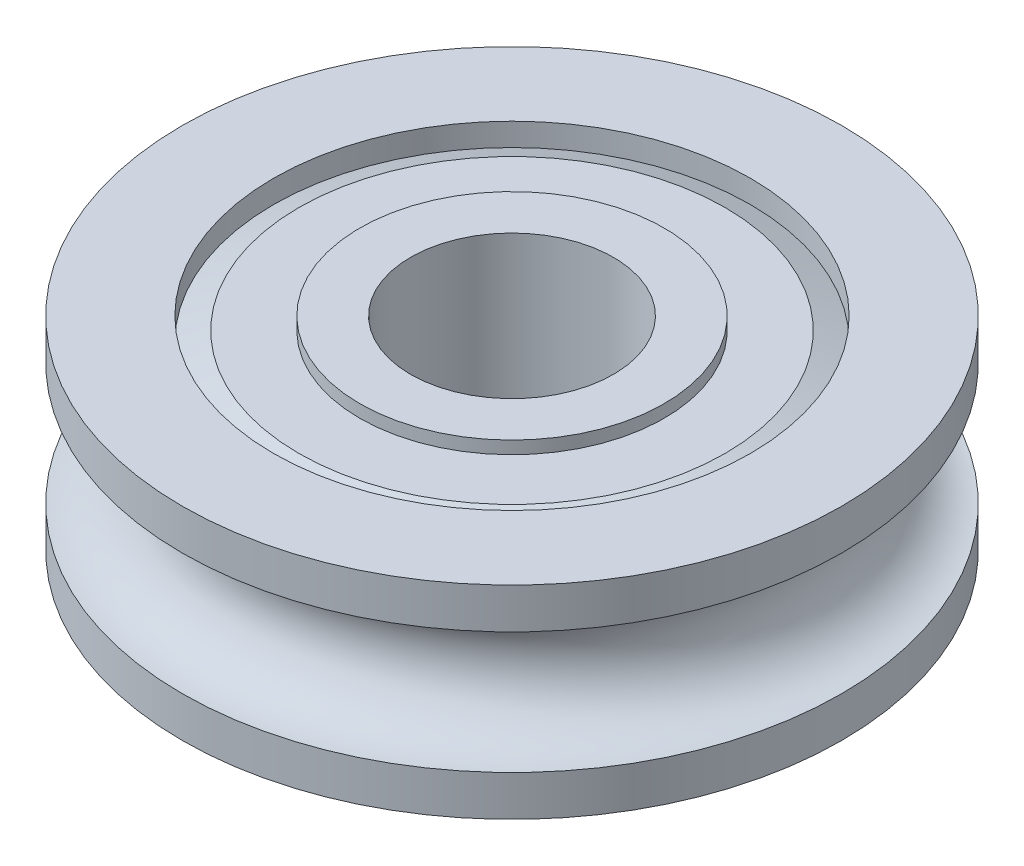
ISO-10303-21;
HEADER;
FILE_DESCRIPTION(('STEP AP214'),'2;1');
FILE_NAME('part.step','',(''),(''),'','','');
FILE_SCHEMA(('AUTOMOTIVE_DESIGN { 1 0 10303 214 1 1 1 1 }'));
ENDSEC;
DATA;
#1=APPLICATION_CONTEXT('core data for automotive mechanical design processes');
#2=APPLICATION_PROTOCOL_DEFINITION('international standard','automotive_design',2000,#1);
#3=PRODUCT_CONTEXT('',#1,'mechanical');
#4=PRODUCT('Part','Part','',(#3));
#5=PRODUCT_RELATED_PRODUCT_CATEGORY('part','',(#4));
#6=PRODUCT_DEFINITION_FORMATION('','',#4);
#7=PRODUCT_DEFINITION_CONTEXT('part definition',#1,'design');
#8=PRODUCT_DEFINITION('design','',#6,#7);
#9=PRODUCT_DEFINITION_SHAPE('','',#8);
#10=(LENGTH_UNIT() NAMED_UNIT(*) SI_UNIT(.MILLI.,.METRE.));
#11=(NAMED_UNIT(*) PLANE_ANGLE_UNIT() SI_UNIT($,.RADIAN.));
#12=(NAMED_UNIT(*) SI_UNIT($,.STERADIAN.) SOLID_ANGLE_UNIT());
#13=UNCERTAINTY_MEASURE_WITH_UNIT(LENGTH_MEASURE(1.E-05),#10,'distance_accuracy_value','');
#14=(GEOMETRIC_REPRESENTATION_CONTEXT(3) GLOBAL_UNCERTAINTY_ASSIGNED_CONTEXT((#13)) GLOBAL_UNIT_ASSIGNED_CONTEXT((#10,
#11,#12)) REPRESENTATION_CONTEXT('',''));
#15=CARTESIAN_POINT('',(0.,0.,0.));
#16=DIRECTION('',(0.,0.,1.));
#17=DIRECTION('',(1.,0.,0.));
#18=AXIS2_PLACEMENT_3D('',#15,#16,#17);
#19=CARTESIAN_POINT('',(0.,-1.75,0.));
#20=DIRECTION('',(0.,-1.,0.));
#21=DIRECTION('',(0.,0.,1.));
#22=AXIS2_PLACEMENT_3D('',#19,#20,#21);
#23=PLANE('',#22);
#24=CARTESIAN_POINT('',(0.,-1.75,0.));
#25=DIRECTION('',(0.,1.,0.));
#26=DIRECTION('',(0.,0.,1.));
#27=AXIS2_PLACEMENT_3D('',#24,#25,#26);
#28=CIRCLE('',#27,3.);
#29=CARTESIAN_POINT('',(0.,-1.75,3.));
#30=VERTEX_POINT('',#29);
#31=EDGE_CURVE('E74',#30,#30,#28,.T.);
#32=ORIENTED_EDGE('',*,*,#31,.T.);
#33=EDGE_LOOP('',(#32));
#34=FACE_BOUND('',#33,.T.);
#35=CARTESIAN_POINT('',(0.,-1.75,0.));
#36=DIRECTION('',(0.,-1.,0.));
#37=DIRECTION('',(0.,0.,-1.));
#38=AXIS2_PLACEMENT_3D('',#35,#36,#37);
#39=CIRCLE('',#38,4.2);
#40=CARTESIAN_POINT('',(0.,-1.75,-4.2));
#41=VERTEX_POINT('',#40);
#42=EDGE_CURVE('E78',#41,#41,#39,.T.);
#43=ORIENTED_EDGE('',*,*,#42,.T.);
#44=EDGE_LOOP('',(#43));
#45=FACE_BOUND('',#44,.T.);
#46=ADVANCED_FACE('F30',(#34,#45),#23,.T.);
#47=CARTESIAN_POINT('',(6.5,-2.,0.));
#48=DIRECTION('',(0.,1.,0.));
#49=DIRECTION('',(0.,0.,1.));
#50=AXIS2_PLACEMENT_3D('',#47,#48,#49);
#51=PLANE('',#50);
#52=CARTESIAN_POINT('',(0.,-2.,0.));
#53=DIRECTION('',(0.,1.,0.));
#54=DIRECTION('',(0.,0.,1.));
#55=AXIS2_PLACEMENT_3D('',#52,#53,#54);
#56=CIRCLE('',#55,2.);
#57=CARTESIAN_POINT('',(0.,-2.,2.));
#58=VERTEX_POINT('',#57);
#59=EDGE_CURVE('E50',#58,#58,#56,.T.);
#60=ORIENTED_EDGE('',*,*,#59,.T.);
#61=EDGE_LOOP('',(#60));
#62=FACE_BOUND('',#61,.T.);
#63=CARTESIAN_POINT('',(0.,-2.,0.));
#64=DIRECTION('',(0.,1.,0.));
#65=DIRECTION('',(0.,0.,1.));
#66=AXIS2_PLACEMENT_3D('',#63,#64,#65);
#67=CIRCLE('',#66,3.);
#68=CARTESIAN_POINT('',(0.,-2.,3.));
#69=VERTEX_POINT('',#68);
#70=EDGE_CURVE('E75',#69,#69,#67,.T.);
#71=ORIENTED_EDGE('',*,*,#70,.F.);
#72=EDGE_LOOP('',(#71));
#73=FACE_BOUND('',#72,.T.);
#74=ADVANCED_FACE('F108',(#62,#73),#51,.F.);
#75=CARTESIAN_POINT('',(0.,1.75,0.));
#76=DIRECTION('',(0.,1.,0.));
#77=DIRECTION('',(0.,0.,1.));
#78=AXIS2_PLACEMENT_3D('',#75,#76,#77);
#79=PLANE('',#78);
#80=CARTESIAN_POINT('',(0.,1.75,0.));
#81=DIRECTION('',(0.,1.,0.));
#82=DIRECTION('',(0.,0.,1.));
#83=AXIS2_PLACEMENT_3D('',#80,#81,#82);
#84=CIRCLE('',#83,3.);
#85=CARTESIAN_POINT('',(0.,1.75,3.));
#86=VERTEX_POINT('',#85);
#87=EDGE_CURVE('E59',#86,#86,#84,.T.);
#88=ORIENTED_EDGE('',*,*,#87,.F.);
#89=EDGE_LOOP('',(#88));
#90=FACE_BOUND('',#89,.T.);
#91=CARTESIAN_POINT('',(0.,1.75,0.));
#92=DIRECTION('',(0.,-1.,0.));
#93=DIRECTION('',(0.,0.,-1.));
#94=AXIS2_PLACEMENT_3D('',#91,#92,#93);
#95=CIRCLE('',#94,4.2);
#96=CARTESIAN_POINT('',(0.,1.75,-4.2));
#97=VERTEX_POINT('',#96);
#98=EDGE_CURVE('E63',#97,#97,#95,.T.);
#99=ORIENTED_EDGE('',*,*,#98,.F.);
#100=EDGE_LOOP('',(#99));
#101=FACE_BOUND('',#100,.T.);
#102=ADVANCED_FACE('F113',(#90,#101),#79,.T.);
#103=CARTESIAN_POINT('',(0.,2.,0.));
#104=DIRECTION('',(0.,-1.,0.));
#105=DIRECTION('',(0.,0.,-1.));
#106=AXIS2_PLACEMENT_3D('',#103,#104,#105);
#107=PLANE('',#106);
#108=CARTESIAN_POINT('',(0.,2.,0.));
#109=DIRECTION('',(0.,1.,0.));
#110=DIRECTION('',(0.,0.,1.));
#111=AXIS2_PLACEMENT_3D('',#108,#109,#110);
#112=CIRCLE('',#111,2.);
#113=CARTESIAN_POINT('',(0.,2.,2.));
#114=VERTEX_POINT('',#113);
#115=EDGE_CURVE('E51',#114,#114,#112,.T.);
#116=ORIENTED_EDGE('',*,*,#115,.F.);
#117=EDGE_LOOP('',(#116));
#118=FACE_BOUND('',#117,.T.);
#119=CARTESIAN_POINT('',(0.,2.,0.));
#120=DIRECTION('',(0.,1.,0.));
#121=DIRECTION('',(0.,0.,1.));
#122=AXIS2_PLACEMENT_3D('',#119,#120,#121);
#123=CIRCLE('',#122,3.);
#124=CARTESIAN_POINT('',(0.,2.,3.));
#125=VERTEX_POINT('',#124);
#126=EDGE_CURVE('E60',#125,#125,#123,.T.);
#127=ORIENTED_EDGE('',*,*,#126,.T.);
#128=EDGE_LOOP('',(#127));
#129=FACE_BOUND('',#128,.T.);
#130=ADVANCED_FACE('F184',(#118,#129),#107,.F.);
#131=CARTESIAN_POINT('',(0.,0.,0.));
#132=DIRECTION('',(0.,1.,0.));
#133=DIRECTION('',(0.,0.,1.));
#134=AXIS2_PLACEMENT_3D('',#131,#132,#133);
#135=TOROIDAL_SURFACE('',#134,6.5,1.2);
#136=CARTESIAN_POINT('',(0.,1.2,0.));
#137=DIRECTION('',(0.,1.,0.));
#138=DIRECTION('',(0.,0.,1.));
#139=AXIS2_PLACEMENT_3D('',#136,#137,#138);
#140=CIRCLE('',#139,6.5);
#141=CARTESIAN_POINT('',(0.,1.2,6.5));
#142=VERTEX_POINT('',#141);
#143=EDGE_CURVE('E10',#142,#142,#140,.T.);
#144=ORIENTED_EDGE('',*,*,#143,.F.);
#145=EDGE_LOOP('',(#144));
#146=FACE_BOUND('',#145,.T.);
#147=CARTESIAN_POINT('',(0.,-1.2,0.));
#148=DIRECTION('',(0.,1.,0.));
#149=DIRECTION('',(0.,0.,1.));
#150=AXIS2_PLACEMENT_3D('',#147,#148,#149);
#151=CIRCLE('',#150,6.5);
#152=CARTESIAN_POINT('',(0.,-1.2,6.5));
#153=VERTEX_POINT('',#152);
#154=EDGE_CURVE('E45',#153,#153,#151,.T.);
#155=ORIENTED_EDGE('',*,*,#154,.T.);
#156=EDGE_LOOP('',(#155));
#157=FACE_BOUND('',#156,.T.);
#158=ADVANCED_FACE('F32',(#146,#157),#135,.F.);
#159=CARTESIAN_POINT('',(0.,2.,0.));
#160=DIRECTION('',(0.,1.,0.));
#161=DIRECTION('',(0.,0.,1.));
#162=AXIS2_PLACEMENT_3D('',#159,#160,#161);
#163=CYLINDRICAL_SURFACE('',#162,6.5);
#164=CARTESIAN_POINT('',(0.,2.,0.));
#165=DIRECTION('',(0.,1.,0.));
#166=DIRECTION('',(0.,0.,1.));
#167=AXIS2_PLACEMENT_3D('',#164,#165,#166);
#168=CIRCLE('',#167,6.5);
#169=CARTESIAN_POINT('',(0.,2.,6.5));
#170=VERTEX_POINT('',#169);
#171=EDGE_CURVE('E37',#170,#170,#168,.T.);
#172=ORIENTED_EDGE('',*,*,#171,.F.);
#173=EDGE_LOOP('',(#172));
#174=FACE_BOUND('',#173,.T.);
#175=ORIENTED_EDGE('',*,*,#143,.T.);
#176=EDGE_LOOP('',(#175));
#177=FACE_BOUND('',#176,.T.);
#178=ADVANCED_FACE('F201',(#174,#177),#163,.T.);
#179=CARTESIAN_POINT('',(0.,2.,0.));
#180=DIRECTION('',(0.,1.,0.));
#181=DIRECTION('',(0.,0.,1.));
#182=AXIS2_PLACEMENT_3D('',#179,#180,#181);
#183=CIRCLE('',#182,4.7);
#184=CARTESIAN_POINT('',(0.,2.,4.7));
#185=VERTEX_POINT('',#184);
#186=EDGE_CURVE('E54',#185,#185,#183,.T.);
#187=ORIENTED_EDGE('',*,*,#186,.F.);
#188=EDGE_LOOP('',(#187));
#189=FACE_BOUND('',#188,.T.);
#190=ORIENTED_EDGE('',*,*,#171,.T.);
#191=EDGE_LOOP('',(#190));
#192=FACE_BOUND('',#191,.T.);
#193=ADVANCED_FACE('F142',(#189,#192),#107,.F.);
#194=CARTESIAN_POINT('',(0.,-2.,0.));
#195=DIRECTION('',(0.,1.,0.));
#196=DIRECTION('',(0.,0.,1.));
#197=AXIS2_PLACEMENT_3D('',#194,#195,#196);
#198=CIRCLE('',#197,4.7);
#199=CARTESIAN_POINT('',(0.,-2.,4.7));
#200=VERTEX_POINT('',#199);
#201=EDGE_CURVE('E71',#200,#200,#198,.T.);
#202=ORIENTED_EDGE('',*,*,#201,.T.);
#203=EDGE_LOOP('',(#202));
#204=FACE_BOUND('',#203,.T.);
#205=CARTESIAN_POINT('',(0.,-2.,0.));
#206=DIRECTION('',(0.,1.,0.));
#207=DIRECTION('',(0.,0.,1.));
#208=AXIS2_PLACEMENT_3D('',#205,#206,#207);
#209=CIRCLE('',#208,6.5);
#210=CARTESIAN_POINT('',(0.,-2.,6.5));
#211=VERTEX_POINT('',#210);
#212=EDGE_CURVE('E41',#211,#211,#209,.T.);
#213=ORIENTED_EDGE('',*,*,#212,.F.);
#214=EDGE_LOOP('',(#213));
#215=FACE_BOUND('',#214,.T.);
#216=ADVANCED_FACE('F116',(#204,#215),#51,.F.);
#217=CARTESIAN_POINT('',(0.,2.,0.));
#218=DIRECTION('',(0.,1.,0.));
#219=DIRECTION('',(0.,0.,1.));
#220=AXIS2_PLACEMENT_3D('',#217,#218,#219);
#221=CYLINDRICAL_SURFACE('',#220,6.5);
#222=ORIENTED_EDGE('',*,*,#154,.F.);
#223=EDGE_LOOP('',(#222));
#224=FACE_BOUND('',#223,.T.);
#225=ORIENTED_EDGE('',*,*,#212,.T.);
#226=EDGE_LOOP('',(#225));
#227=FACE_BOUND('',#226,.T.);
#228=ADVANCED_FACE('F141',(#224,#227),#221,.T.);
#229=CARTESIAN_POINT('',(0.,-2.,0.));
#230=DIRECTION('',(0.,1.,0.));
#231=DIRECTION('',(0.,0.,1.));
#232=AXIS2_PLACEMENT_3D('',#229,#230,#231);
#233=CYLINDRICAL_SURFACE('',#232,2.);
#234=ORIENTED_EDGE('',*,*,#59,.F.);
#235=EDGE_LOOP('',(#234));
#236=FACE_BOUND('',#235,.T.);
#237=ORIENTED_EDGE('',*,*,#115,.T.);
#238=EDGE_LOOP('',(#237));
#239=FACE_BOUND('',#238,.T.);
#240=ADVANCED_FACE('F173',(#236,#239),#233,.F.);
#241=CARTESIAN_POINT('',(0.,1.75,0.));
#242=DIRECTION('',(0.,1.,0.));
#243=DIRECTION('',(0.,0.,1.));
#244=AXIS2_PLACEMENT_3D('',#241,#242,#243);
#245=CYLINDRICAL_SURFACE('',#244,4.7);
#246=ORIENTED_EDGE('',*,*,#186,.T.);
#247=EDGE_LOOP('',(#246));
#248=FACE_BOUND('',#247,.T.);
#249=CARTESIAN_POINT('',(0.,1.55,0.));
#250=DIRECTION('',(0.,-1.,0.));
#251=DIRECTION('',(0.,0.,-1.));
#252=AXIS2_PLACEMENT_3D('',#249,#250,#251);
#253=CIRCLE('',#252,4.7);
#254=CARTESIAN_POINT('',(0.,1.55,-4.7));
#255=VERTEX_POINT('',#254);
#256=EDGE_CURVE('E68',#255,#255,#253,.T.);
#257=ORIENTED_EDGE('',*,*,#256,.T.);
#258=EDGE_LOOP('',(#257));
#259=FACE_BOUND('',#258,.T.);
#260=ADVANCED_FACE('F169',(#248,#259),#245,.F.);
#261=CARTESIAN_POINT('',(0.,1.75,0.));
#262=DIRECTION('',(0.,1.,0.));
#263=DIRECTION('',(0.,0.,1.));
#264=AXIS2_PLACEMENT_3D('',#261,#262,#263);
#265=CYLINDRICAL_SURFACE('',#264,3.);
#266=ORIENTED_EDGE('',*,*,#87,.T.);
#267=EDGE_LOOP('',(#266));
#268=FACE_BOUND('',#267,.T.);
#269=ORIENTED_EDGE('',*,*,#126,.F.);
#270=EDGE_LOOP('',(#269));
#271=FACE_BOUND('',#270,.T.);
#272=ADVANCED_FACE('F102',(#268,#271),#265,.T.);
#273=CARTESIAN_POINT('',(0.,1.75,0.));
#274=DIRECTION('',(0.,-1.,0.));
#275=DIRECTION('',(0.,0.,-1.));
#276=AXIS2_PLACEMENT_3D('',#273,#274,#275);
#277=CONICAL_SURFACE('',#276,4.2,1.19028994968253);
#278=ORIENTED_EDGE('',*,*,#256,.F.);
#279=EDGE_LOOP('',(#278));
#280=FACE_BOUND('',#279,.T.);
#281=ORIENTED_EDGE('',*,*,#98,.T.);
#282=EDGE_LOOP('',(#281));
#283=FACE_BOUND('',#282,.T.);
#284=ADVANCED_FACE('F93',(#280,#283),#277,.T.);
#285=CARTESIAN_POINT('',(0.,-1.75,0.));
#286=DIRECTION('',(0.,-1.,0.));
#287=DIRECTION('',(0.,0.,-1.));
#288=AXIS2_PLACEMENT_3D('',#285,#286,#287);
#289=CYLINDRICAL_SURFACE('',#288,4.7);
#290=ORIENTED_EDGE('',*,*,#201,.F.);
#291=EDGE_LOOP('',(#290));
#292=FACE_BOUND('',#291,.T.);
#293=CARTESIAN_POINT('',(0.,-1.55,0.));
#294=DIRECTION('',(0.,-1.,0.));
#295=DIRECTION('',(0.,0.,-1.));
#296=AXIS2_PLACEMENT_3D('',#293,#294,#295);
#297=CIRCLE('',#296,4.7);
#298=CARTESIAN_POINT('',(0.,-1.55,-4.7));
#299=VERTEX_POINT('',#298);
#300=EDGE_CURVE('E83',#299,#299,#297,.T.);
#301=ORIENTED_EDGE('',*,*,#300,.F.);
#302=EDGE_LOOP('',(#301));
#303=FACE_BOUND('',#302,.T.);
#304=ADVANCED_FACE('F90',(#292,#303),#289,.F.);
#305=CARTESIAN_POINT('',(0.,-1.75,0.));
#306=DIRECTION('',(0.,-1.,0.));
#307=DIRECTION('',(0.,0.,-1.));
#308=AXIS2_PLACEMENT_3D('',#305,#306,#307);
#309=CYLINDRICAL_SURFACE('',#308,3.);
#310=ORIENTED_EDGE('',*,*,#31,.F.);
#311=EDGE_LOOP('',(#310));
#312=FACE_BOUND('',#311,.T.);
#313=ORIENTED_EDGE('',*,*,#70,.T.);
#314=EDGE_LOOP('',(#313));
#315=FACE_BOUND('',#314,.T.);
#316=ADVANCED_FACE('F92',(#312,#315),#309,.T.);
#317=CARTESIAN_POINT('',(0.,-1.75,0.));
#318=DIRECTION('',(0.,1.,0.));
#319=DIRECTION('',(0.,0.,-1.));
#320=AXIS2_PLACEMENT_3D('',#317,#318,#319);
#321=CONICAL_SURFACE('',#320,4.2,1.19028994968253);
#322=ORIENTED_EDGE('',*,*,#300,.T.);
#323=EDGE_LOOP('',(#322));
#324=FACE_BOUND('',#323,.T.);
#325=ORIENTED_EDGE('',*,*,#42,.F.);
#326=EDGE_LOOP('',(#325));
#327=FACE_BOUND('',#326,.T.);
#328=ADVANCED_FACE('F87',(#324,#327),#321,.T.);
#329=CLOSED_SHELL('',(#46,#74,#102,#130,#158,#178,#193,#216,#228,#240,#260,#272,#284,#304,#316,#328));
#330=MANIFOLD_SOLID_BREP('B2',#329);
#331=ADVANCED_BREP_SHAPE_REPRESENTATION('',(#18,#330),#14);
#332=SHAPE_DEFINITION_REPRESENTATION(#9,#331);
ENDSEC;
END-ISO-10303-21;
